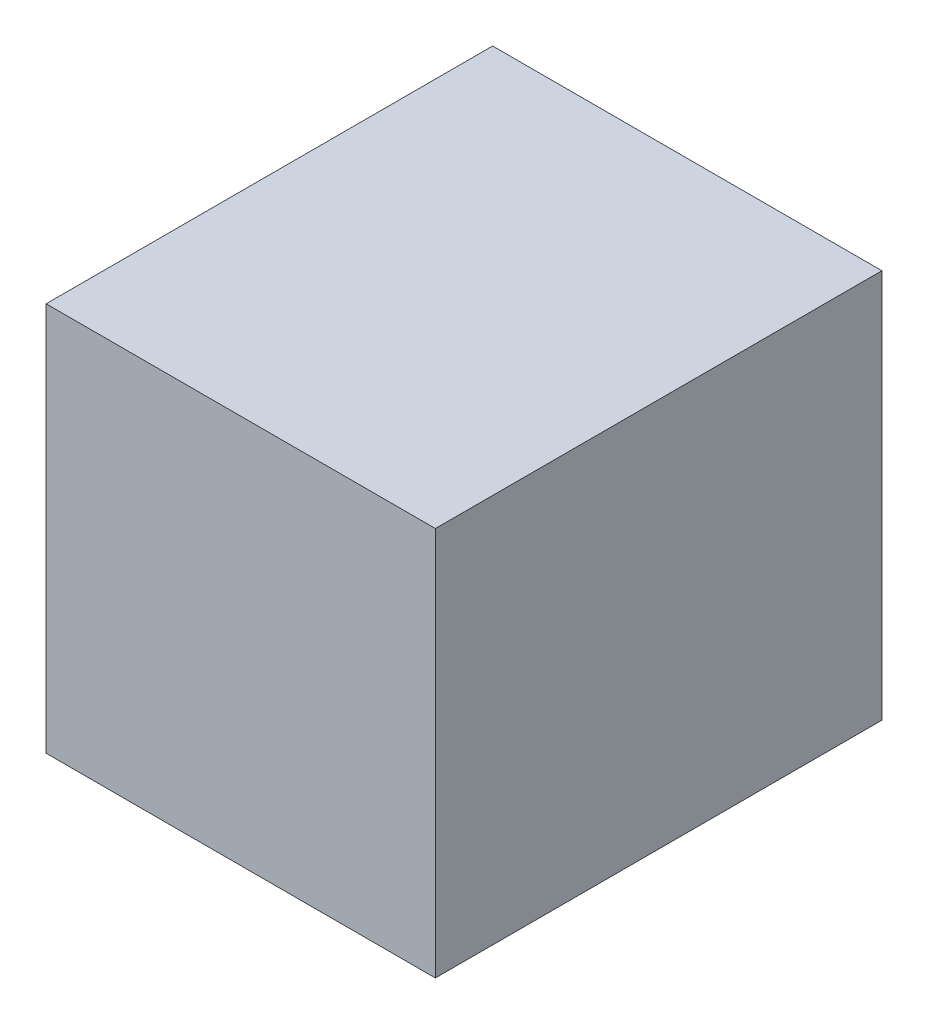
ISO-10303-21;
HEADER;
FILE_DESCRIPTION(('STEP AP214'),'2;1');
FILE_NAME('part.step','',(''),(''),'','','');
FILE_SCHEMA(('AUTOMOTIVE_DESIGN { 1 0 10303 214 1 1 1 1 }'));
ENDSEC;
DATA;
#1=APPLICATION_CONTEXT('core data for automotive mechanical design processes');
#2=APPLICATION_PROTOCOL_DEFINITION('international standard','automotive_design',2000,#1);
#3=PRODUCT_CONTEXT('',#1,'mechanical');
#4=PRODUCT('Part','Part','',(#3));
#5=PRODUCT_RELATED_PRODUCT_CATEGORY('part','',(#4));
#6=PRODUCT_DEFINITION_FORMATION('','',#4);
#7=PRODUCT_DEFINITION_CONTEXT('part definition',#1,'design');
#8=PRODUCT_DEFINITION('design','',#6,#7);
#9=PRODUCT_DEFINITION_SHAPE('','',#8);
#10=(LENGTH_UNIT() NAMED_UNIT(*) SI_UNIT(.MILLI.,.METRE.));
#11=(NAMED_UNIT(*) PLANE_ANGLE_UNIT() SI_UNIT($,.RADIAN.));
#12=(NAMED_UNIT(*) SI_UNIT($,.STERADIAN.) SOLID_ANGLE_UNIT());
#13=UNCERTAINTY_MEASURE_WITH_UNIT(LENGTH_MEASURE(1.E-05),#10,'distance_accuracy_value','');
#14=(GEOMETRIC_REPRESENTATION_CONTEXT(3) GLOBAL_UNCERTAINTY_ASSIGNED_CONTEXT((#13)) GLOBAL_UNIT_ASSIGNED_CONTEXT((#10,
#11,#12)) REPRESENTATION_CONTEXT('',''));
#15=CARTESIAN_POINT('',(0.,0.,0.));
#16=DIRECTION('',(0.,0.,1.));
#17=DIRECTION('',(1.,0.,0.));
#18=AXIS2_PLACEMENT_3D('',#15,#16,#17);
#19=CARTESIAN_POINT('',(-51.,-51.,0.));
#20=DIRECTION('',(1.,0.,0.));
#21=DIRECTION('',(0.,0.,-1.));
#22=AXIS2_PLACEMENT_3D('',#19,#20,#21);
#23=PLANE('',#22);
#24=DIRECTION('',(0.,-1.,0.));
#25=VECTOR('',#24,1.);
#26=CARTESIAN_POINT('',(-51.,51.,-117.));
#27=LINE('',#26,#25);
#28=CARTESIAN_POINT('',(-51.,51.,-117.));
#29=VERTEX_POINT('',#28);
#30=CARTESIAN_POINT('',(-51.,-51.,-117.));
#31=VERTEX_POINT('',#30);
#32=EDGE_CURVE('E10',#29,#31,#27,.T.);
#33=ORIENTED_EDGE('',*,*,#32,.T.);
#34=DIRECTION('',(0.,0.,-1.));
#35=VECTOR('',#34,1.);
#36=CARTESIAN_POINT('',(-51.,-51.,0.));
#37=LINE('',#36,#35);
#38=CARTESIAN_POINT('',(-51.,-51.,0.));
#39=VERTEX_POINT('',#38);
#40=EDGE_CURVE('E35',#39,#31,#37,.T.);
#41=ORIENTED_EDGE('',*,*,#40,.F.);
#42=DIRECTION('',(0.,-1.,0.));
#43=VECTOR('',#42,1.);
#44=CARTESIAN_POINT('',(-51.,51.,0.));
#45=LINE('',#44,#43);
#46=CARTESIAN_POINT('',(-51.,51.,0.));
#47=VERTEX_POINT('',#46);
#48=EDGE_CURVE('E74',#47,#39,#45,.T.);
#49=ORIENTED_EDGE('',*,*,#48,.F.);
#50=DIRECTION('',(0.,0.,-1.));
#51=VECTOR('',#50,1.);
#52=CARTESIAN_POINT('',(-51.,51.,0.));
#53=LINE('',#52,#51);
#54=EDGE_CURVE('E26',#47,#29,#53,.T.);
#55=ORIENTED_EDGE('',*,*,#54,.T.);
#56=EDGE_LOOP('',(#33,#41,#49,#55));
#57=FACE_BOUND('',#56,.T.);
#58=ADVANCED_FACE('F15',(#57),#23,.F.);
#59=CARTESIAN_POINT('',(-51.,-51.,0.));
#60=DIRECTION('',(0.,1.,0.));
#61=DIRECTION('',(0.,0.,1.));
#62=AXIS2_PLACEMENT_3D('',#59,#60,#61);
#63=PLANE('',#62);
#64=DIRECTION('',(1.,0.,0.));
#65=VECTOR('',#64,1.);
#66=CARTESIAN_POINT('',(-51.,-51.,-117.));
#67=LINE('',#66,#65);
#68=CARTESIAN_POINT('',(51.,-51.,-117.));
#69=VERTEX_POINT('',#68);
#70=EDGE_CURVE('E88',#31,#69,#67,.T.);
#71=ORIENTED_EDGE('',*,*,#70,.T.);
#72=DIRECTION('',(0.,0.,-1.));
#73=VECTOR('',#72,1.);
#74=CARTESIAN_POINT('',(51.,-51.,0.));
#75=LINE('',#74,#73);
#76=CARTESIAN_POINT('',(51.,-51.,0.));
#77=VERTEX_POINT('',#76);
#78=EDGE_CURVE('E96',#77,#69,#75,.T.);
#79=ORIENTED_EDGE('',*,*,#78,.F.);
#80=DIRECTION('',(1.,0.,0.));
#81=VECTOR('',#80,1.);
#82=CARTESIAN_POINT('',(-51.,-51.,0.));
#83=LINE('',#82,#81);
#84=EDGE_CURVE('E63',#39,#77,#83,.T.);
#85=ORIENTED_EDGE('',*,*,#84,.F.);
#86=ORIENTED_EDGE('',*,*,#40,.T.);
#87=EDGE_LOOP('',(#71,#79,#85,#86));
#88=FACE_BOUND('',#87,.T.);
#89=ADVANCED_FACE('F116',(#88),#63,.F.);
#90=CARTESIAN_POINT('',(51.,-51.,0.));
#91=DIRECTION('',(-1.,0.,0.));
#92=DIRECTION('',(0.,0.,1.));
#93=AXIS2_PLACEMENT_3D('',#90,#91,#92);
#94=PLANE('',#93);
#95=DIRECTION('',(0.,1.,0.));
#96=VECTOR('',#95,1.);
#97=CARTESIAN_POINT('',(51.,-51.,-117.));
#98=LINE('',#97,#96);
#99=CARTESIAN_POINT('',(51.,51.,-117.));
#100=VERTEX_POINT('',#99);
#101=EDGE_CURVE('E70',#69,#100,#98,.T.);
#102=ORIENTED_EDGE('',*,*,#101,.T.);
#103=DIRECTION('',(0.,0.,-1.));
#104=VECTOR('',#103,1.);
#105=CARTESIAN_POINT('',(51.,51.,0.));
#106=LINE('',#105,#104);
#107=CARTESIAN_POINT('',(51.,51.,0.));
#108=VERTEX_POINT('',#107);
#109=EDGE_CURVE('E55',#108,#100,#106,.T.);
#110=ORIENTED_EDGE('',*,*,#109,.F.);
#111=DIRECTION('',(0.,1.,0.));
#112=VECTOR('',#111,1.);
#113=CARTESIAN_POINT('',(51.,-51.,0.));
#114=LINE('',#113,#112);
#115=EDGE_CURVE('E61',#77,#108,#114,.T.);
#116=ORIENTED_EDGE('',*,*,#115,.F.);
#117=ORIENTED_EDGE('',*,*,#78,.T.);
#118=EDGE_LOOP('',(#102,#110,#116,#117));
#119=FACE_BOUND('',#118,.T.);
#120=ADVANCED_FACE('F68',(#119),#94,.F.);
#121=CARTESIAN_POINT('',(-51.,51.,0.));
#122=DIRECTION('',(0.,-1.,0.));
#123=DIRECTION('',(0.,0.,-1.));
#124=AXIS2_PLACEMENT_3D('',#121,#122,#123);
#125=PLANE('',#124);
#126=DIRECTION('',(-1.,0.,0.));
#127=VECTOR('',#126,1.);
#128=CARTESIAN_POINT('',(51.,51.,-117.));
#129=LINE('',#128,#127);
#130=EDGE_CURVE('E73',#100,#29,#129,.T.);
#131=ORIENTED_EDGE('',*,*,#130,.T.);
#132=ORIENTED_EDGE('',*,*,#54,.F.);
#133=DIRECTION('',(-1.,0.,0.));
#134=VECTOR('',#133,1.);
#135=CARTESIAN_POINT('',(51.,51.,0.));
#136=LINE('',#135,#134);
#137=EDGE_CURVE('E19',#108,#47,#136,.T.);
#138=ORIENTED_EDGE('',*,*,#137,.F.);
#139=ORIENTED_EDGE('',*,*,#109,.T.);
#140=EDGE_LOOP('',(#131,#132,#138,#139));
#141=FACE_BOUND('',#140,.T.);
#142=ADVANCED_FACE('F77',(#141),#125,.F.);
#143=CARTESIAN_POINT('',(-51.,-51.,0.));
#144=DIRECTION('',(0.,0.,-1.));
#145=DIRECTION('',(-1.,0.,0.));
#146=AXIS2_PLACEMENT_3D('',#143,#144,#145);
#147=PLANE('',#146);
#148=ORIENTED_EDGE('',*,*,#48,.T.);
#149=ORIENTED_EDGE('',*,*,#84,.T.);
#150=ORIENTED_EDGE('',*,*,#115,.T.);
#151=ORIENTED_EDGE('',*,*,#137,.T.);
#152=EDGE_LOOP('',(#148,#149,#150,#151));
#153=FACE_BOUND('',#152,.T.);
#154=ADVANCED_FACE('F62',(#153),#147,.F.);
#155=CARTESIAN_POINT('',(-51.,-51.,-117.));
#156=DIRECTION('',(0.,0.,-1.));
#157=DIRECTION('',(-1.,0.,0.));
#158=AXIS2_PLACEMENT_3D('',#155,#156,#157);
#159=PLANE('',#158);
#160=ORIENTED_EDGE('',*,*,#32,.F.);
#161=ORIENTED_EDGE('',*,*,#130,.F.);
#162=ORIENTED_EDGE('',*,*,#101,.F.);
#163=ORIENTED_EDGE('',*,*,#70,.F.);
#164=EDGE_LOOP('',(#160,#161,#162,#163));
#165=FACE_BOUND('',#164,.T.);
#166=ADVANCED_FACE('F17',(#165),#159,.T.);
#167=CLOSED_SHELL('',(#58,#89,#120,#142,#154,#166));
#168=MANIFOLD_SOLID_BREP('B1',#167);
#169=ADVANCED_BREP_SHAPE_REPRESENTATION('',(#18,#168),#14);
#170=SHAPE_DEFINITION_REPRESENTATION(#9,#169);
ENDSEC;
END-ISO-10303-21;
